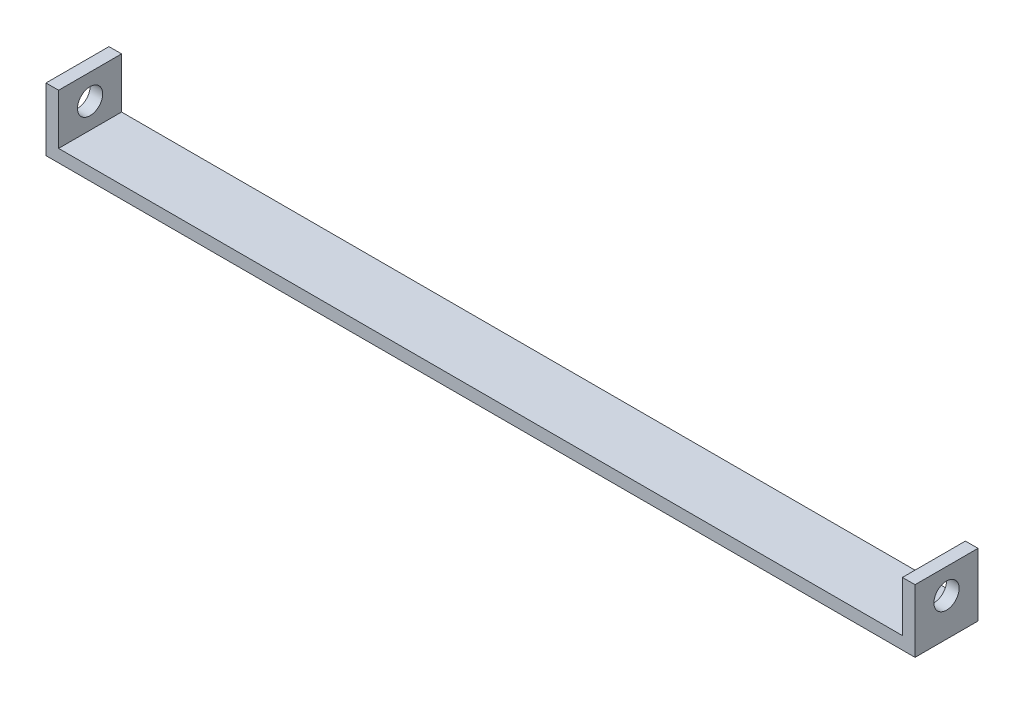
ISO-10303-21;
HEADER;
FILE_DESCRIPTION(('STEP AP214'),'2;1');
FILE_NAME('part.step','',(''),(''),'','','');
FILE_SCHEMA(('AUTOMOTIVE_DESIGN { 1 0 10303 214 1 1 1 1 }'));
ENDSEC;
DATA;
#1=APPLICATION_CONTEXT('core data for automotive mechanical design processes');
#2=APPLICATION_PROTOCOL_DEFINITION('international standard','automotive_design',2000,#1);
#3=PRODUCT_CONTEXT('',#1,'mechanical');
#4=PRODUCT('Part','Part','',(#3));
#5=PRODUCT_RELATED_PRODUCT_CATEGORY('part','',(#4));
#6=PRODUCT_DEFINITION_FORMATION('','',#4);
#7=PRODUCT_DEFINITION_CONTEXT('part definition',#1,'design');
#8=PRODUCT_DEFINITION('design','',#6,#7);
#9=PRODUCT_DEFINITION_SHAPE('','',#8);
#10=(LENGTH_UNIT() NAMED_UNIT(*) SI_UNIT(.MILLI.,.METRE.));
#11=(NAMED_UNIT(*) PLANE_ANGLE_UNIT() SI_UNIT($,.RADIAN.));
#12=(NAMED_UNIT(*) SI_UNIT($,.STERADIAN.) SOLID_ANGLE_UNIT());
#13=UNCERTAINTY_MEASURE_WITH_UNIT(LENGTH_MEASURE(1.E-05),#10,'distance_accuracy_value','');
#14=(GEOMETRIC_REPRESENTATION_CONTEXT(3) GLOBAL_UNCERTAINTY_ASSIGNED_CONTEXT((#13)) GLOBAL_UNIT_ASSIGNED_CONTEXT((#10,
#11,#12)) REPRESENTATION_CONTEXT('',''));
#15=CARTESIAN_POINT('',(0.,0.,0.));
#16=DIRECTION('',(0.,0.,1.));
#17=DIRECTION('',(1.,0.,0.));
#18=AXIS2_PLACEMENT_3D('',#15,#16,#17);
#19=CARTESIAN_POINT('',(0.,10.,10.));
#20=DIRECTION('',(1.,0.,0.));
#21=DIRECTION('',(0.,1.,0.));
#22=AXIS2_PLACEMENT_3D('',#19,#20,#21);
#23=PLANE('',#22);
#24=CARTESIAN_POINT('',(0.,6.,5.));
#25=DIRECTION('',(-1.,0.,0.));
#26=DIRECTION('',(0.,-1.,0.));
#27=AXIS2_PLACEMENT_3D('',#24,#25,#26);
#28=CIRCLE('',#27,2.);
#29=CARTESIAN_POINT('',(0.,4.,5.));
#30=VERTEX_POINT('',#29);
#31=EDGE_CURVE('E181',#30,#30,#28,.T.);
#32=ORIENTED_EDGE('',*,*,#31,.F.);
#33=EDGE_LOOP('',(#32));
#34=FACE_BOUND('',#33,.T.);
#35=DIRECTION('',(0.,-1.,0.));
#36=VECTOR('',#35,1.);
#37=CARTESIAN_POINT('',(0.,10.,0.));
#38=LINE('',#37,#36);
#39=CARTESIAN_POINT('',(0.,10.,0.));
#40=VERTEX_POINT('',#39);
#41=CARTESIAN_POINT('',(0.,0.,0.));
#42=VERTEX_POINT('',#41);
#43=EDGE_CURVE('E131',#40,#42,#38,.T.);
#44=ORIENTED_EDGE('',*,*,#43,.T.);
#45=DIRECTION('',(0.,0.,-1.));
#46=VECTOR('',#45,1.);
#47=CARTESIAN_POINT('',(0.,0.,10.));
#48=LINE('',#47,#46);
#49=CARTESIAN_POINT('',(0.,0.,10.));
#50=VERTEX_POINT('',#49);
#51=EDGE_CURVE('E11',#50,#42,#48,.T.);
#52=ORIENTED_EDGE('',*,*,#51,.F.);
#53=DIRECTION('',(0.,-1.,0.));
#54=VECTOR('',#53,1.);
#55=CARTESIAN_POINT('',(0.,10.,10.));
#56=LINE('',#55,#54);
#57=CARTESIAN_POINT('',(0.,10.,10.));
#58=VERTEX_POINT('',#57);
#59=EDGE_CURVE('E146',#58,#50,#56,.T.);
#60=ORIENTED_EDGE('',*,*,#59,.F.);
#61=DIRECTION('',(0.,0.,-1.));
#62=VECTOR('',#61,1.);
#63=CARTESIAN_POINT('',(0.,10.,10.));
#64=LINE('',#63,#62);
#65=EDGE_CURVE('E127',#58,#40,#64,.T.);
#66=ORIENTED_EDGE('',*,*,#65,.T.);
#67=EDGE_LOOP('',(#44,#52,#60,#66));
#68=FACE_BOUND('',#67,.T.);
#69=ADVANCED_FACE('F35',(#34,#68),#23,.F.);
#70=CARTESIAN_POINT('',(0.,0.,10.));
#71=DIRECTION('',(0.,1.,0.));
#72=DIRECTION('',(0.,0.,1.));
#73=AXIS2_PLACEMENT_3D('',#70,#71,#72);
#74=PLANE('',#73);
#75=DIRECTION('',(1.,0.,0.));
#76=VECTOR('',#75,1.);
#77=CARTESIAN_POINT('',(0.,0.,0.));
#78=LINE('',#77,#76);
#79=CARTESIAN_POINT('',(138.,0.,0.));
#80=VERTEX_POINT('',#79);
#81=EDGE_CURVE('E134',#42,#80,#78,.T.);
#82=ORIENTED_EDGE('',*,*,#81,.T.);
#83=DIRECTION('',(0.,0.,-1.));
#84=VECTOR('',#83,1.);
#85=CARTESIAN_POINT('',(138.,0.,10.));
#86=LINE('',#85,#84);
#87=CARTESIAN_POINT('',(138.,0.,10.));
#88=VERTEX_POINT('',#87);
#89=EDGE_CURVE('E43',#88,#80,#86,.T.);
#90=ORIENTED_EDGE('',*,*,#89,.F.);
#91=DIRECTION('',(1.,0.,0.));
#92=VECTOR('',#91,1.);
#93=CARTESIAN_POINT('',(0.,0.,10.));
#94=LINE('',#93,#92);
#95=EDGE_CURVE('E94',#50,#88,#94,.T.);
#96=ORIENTED_EDGE('',*,*,#95,.F.);
#97=ORIENTED_EDGE('',*,*,#51,.T.);
#98=EDGE_LOOP('',(#82,#90,#96,#97));
#99=FACE_BOUND('',#98,.T.);
#100=ADVANCED_FACE('F208',(#99),#74,.F.);
#101=CARTESIAN_POINT('',(138.,0.,10.));
#102=DIRECTION('',(-1.,0.,0.));
#103=DIRECTION('',(0.,0.,1.));
#104=AXIS2_PLACEMENT_3D('',#101,#102,#103);
#105=PLANE('',#104);
#106=CARTESIAN_POINT('',(138.,6.,5.));
#107=DIRECTION('',(-1.,0.,0.));
#108=DIRECTION('',(0.,-1.,0.));
#109=AXIS2_PLACEMENT_3D('',#106,#107,#108);
#110=CIRCLE('',#109,2.);
#111=CARTESIAN_POINT('',(138.,4.,5.));
#112=VERTEX_POINT('',#111);
#113=EDGE_CURVE('E187',#112,#112,#110,.T.);
#114=ORIENTED_EDGE('',*,*,#113,.T.);
#115=EDGE_LOOP('',(#114));
#116=FACE_BOUND('',#115,.T.);
#117=DIRECTION('',(0.,1.,0.));
#118=VECTOR('',#117,1.);
#119=CARTESIAN_POINT('',(138.,0.,0.));
#120=LINE('',#119,#118);
#121=CARTESIAN_POINT('',(138.,10.,0.));
#122=VERTEX_POINT('',#121);
#123=EDGE_CURVE('E137',#80,#122,#120,.T.);
#124=ORIENTED_EDGE('',*,*,#123,.T.);
#125=DIRECTION('',(0.,0.,-1.));
#126=VECTOR('',#125,1.);
#127=CARTESIAN_POINT('',(138.,10.,10.));
#128=LINE('',#127,#126);
#129=CARTESIAN_POINT('',(138.,10.,10.));
#130=VERTEX_POINT('',#129);
#131=EDGE_CURVE('E153',#130,#122,#128,.T.);
#132=ORIENTED_EDGE('',*,*,#131,.F.);
#133=DIRECTION('',(0.,1.,0.));
#134=VECTOR('',#133,1.);
#135=CARTESIAN_POINT('',(138.,0.,10.));
#136=LINE('',#135,#134);
#137=EDGE_CURVE('E161',#88,#130,#136,.T.);
#138=ORIENTED_EDGE('',*,*,#137,.F.);
#139=ORIENTED_EDGE('',*,*,#89,.T.);
#140=EDGE_LOOP('',(#124,#132,#138,#139));
#141=FACE_BOUND('',#140,.T.);
#142=ADVANCED_FACE('F159',(#116,#141),#105,.F.);
#143=CARTESIAN_POINT('',(138.,10.,10.));
#144=DIRECTION('',(0.,-1.,0.));
#145=DIRECTION('',(0.,0.,-1.));
#146=AXIS2_PLACEMENT_3D('',#143,#144,#145);
#147=PLANE('',#146);
#148=DIRECTION('',(-1.,0.,0.));
#149=VECTOR('',#148,1.);
#150=CARTESIAN_POINT('',(138.,10.,0.));
#151=LINE('',#150,#149);
#152=CARTESIAN_POINT('',(136.,10.,0.));
#153=VERTEX_POINT('',#152);
#154=EDGE_CURVE('E139',#122,#153,#151,.T.);
#155=ORIENTED_EDGE('',*,*,#154,.T.);
#156=DIRECTION('',(0.,0.,-1.));
#157=VECTOR('',#156,1.);
#158=CARTESIAN_POINT('',(136.,10.,10.));
#159=LINE('',#158,#157);
#160=CARTESIAN_POINT('',(136.,10.,10.));
#161=VERTEX_POINT('',#160);
#162=EDGE_CURVE('E150',#161,#153,#159,.T.);
#163=ORIENTED_EDGE('',*,*,#162,.F.);
#164=DIRECTION('',(-1.,0.,0.));
#165=VECTOR('',#164,1.);
#166=CARTESIAN_POINT('',(138.,10.,10.));
#167=LINE('',#166,#165);
#168=EDGE_CURVE('E173',#130,#161,#167,.T.);
#169=ORIENTED_EDGE('',*,*,#168,.F.);
#170=ORIENTED_EDGE('',*,*,#131,.T.);
#171=EDGE_LOOP('',(#155,#163,#169,#170));
#172=FACE_BOUND('',#171,.T.);
#173=ADVANCED_FACE('F169',(#172),#147,.F.);
#174=CARTESIAN_POINT('',(136.,10.,10.));
#175=DIRECTION('',(1.,0.,0.));
#176=DIRECTION('',(0.,0.,-1.));
#177=AXIS2_PLACEMENT_3D('',#174,#175,#176);
#178=PLANE('',#177);
#179=CARTESIAN_POINT('',(136.,6.,5.));
#180=DIRECTION('',(1.,0.,0.));
#181=DIRECTION('',(0.,0.,-1.));
#182=AXIS2_PLACEMENT_3D('',#179,#180,#181);
#183=CIRCLE('',#182,2.);
#184=CARTESIAN_POINT('',(136.,6.,3.));
#185=VERTEX_POINT('',#184);
#186=EDGE_CURVE('E184',#185,#185,#183,.F.);
#187=ORIENTED_EDGE('',*,*,#186,.F.);
#188=EDGE_LOOP('',(#187));
#189=FACE_BOUND('',#188,.T.);
#190=DIRECTION('',(0.,-1.,0.));
#191=VECTOR('',#190,1.);
#192=CARTESIAN_POINT('',(136.,10.,0.));
#193=LINE('',#192,#191);
#194=CARTESIAN_POINT('',(136.,2.,0.));
#195=VERTEX_POINT('',#194);
#196=EDGE_CURVE('E141',#153,#195,#193,.T.);
#197=ORIENTED_EDGE('',*,*,#196,.T.);
#198=DIRECTION('',(0.,0.,-1.));
#199=VECTOR('',#198,1.);
#200=CARTESIAN_POINT('',(136.,2.,10.));
#201=LINE('',#200,#199);
#202=CARTESIAN_POINT('',(136.,2.,10.));
#203=VERTEX_POINT('',#202);
#204=EDGE_CURVE('E122',#203,#195,#201,.T.);
#205=ORIENTED_EDGE('',*,*,#204,.F.);
#206=DIRECTION('',(0.,-1.,0.));
#207=VECTOR('',#206,1.);
#208=CARTESIAN_POINT('',(136.,10.,10.));
#209=LINE('',#208,#207);
#210=EDGE_CURVE('E113',#161,#203,#209,.T.);
#211=ORIENTED_EDGE('',*,*,#210,.F.);
#212=ORIENTED_EDGE('',*,*,#162,.T.);
#213=EDGE_LOOP('',(#197,#205,#211,#212));
#214=FACE_BOUND('',#213,.T.);
#215=ADVANCED_FACE('F172',(#189,#214),#178,.F.);
#216=CARTESIAN_POINT('',(136.,2.,10.));
#217=DIRECTION('',(0.,-1.,0.));
#218=DIRECTION('',(1.,0.,0.));
#219=AXIS2_PLACEMENT_3D('',#216,#217,#218);
#220=PLANE('',#219);
#221=DIRECTION('',(-1.,0.,0.));
#222=VECTOR('',#221,1.);
#223=CARTESIAN_POINT('',(136.,2.,0.));
#224=LINE('',#223,#222);
#225=CARTESIAN_POINT('',(2.,1.99999999999999,0.));
#226=VERTEX_POINT('',#225);
#227=EDGE_CURVE('E121',#195,#226,#224,.T.);
#228=ORIENTED_EDGE('',*,*,#227,.T.);
#229=DIRECTION('',(0.,0.,-1.));
#230=VECTOR('',#229,1.);
#231=CARTESIAN_POINT('',(2.,1.99999999999999,10.));
#232=LINE('',#231,#230);
#233=CARTESIAN_POINT('',(2.,1.99999999999999,10.));
#234=VERTEX_POINT('',#233);
#235=EDGE_CURVE('E118',#234,#226,#232,.T.);
#236=ORIENTED_EDGE('',*,*,#235,.F.);
#237=DIRECTION('',(-1.,0.,0.));
#238=VECTOR('',#237,1.);
#239=CARTESIAN_POINT('',(136.,2.,10.));
#240=LINE('',#239,#238);
#241=EDGE_CURVE('E107',#203,#234,#240,.T.);
#242=ORIENTED_EDGE('',*,*,#241,.F.);
#243=ORIENTED_EDGE('',*,*,#204,.T.);
#244=EDGE_LOOP('',(#228,#236,#242,#243));
#245=FACE_BOUND('',#244,.T.);
#246=ADVANCED_FACE('F119',(#245),#220,.F.);
#247=CARTESIAN_POINT('',(2.,1.99999999999999,10.));
#248=DIRECTION('',(-1.,0.,0.));
#249=DIRECTION('',(0.,-1.,0.));
#250=AXIS2_PLACEMENT_3D('',#247,#248,#249);
#251=PLANE('',#250);
#252=CARTESIAN_POINT('',(2.,6.,5.));
#253=DIRECTION('',(-1.,0.,0.));
#254=DIRECTION('',(0.,-1.,0.));
#255=AXIS2_PLACEMENT_3D('',#252,#253,#254);
#256=CIRCLE('',#255,2.);
#257=CARTESIAN_POINT('',(2.,4.,5.));
#258=VERTEX_POINT('',#257);
#259=EDGE_CURVE('E135',#258,#258,#256,.F.);
#260=ORIENTED_EDGE('',*,*,#259,.F.);
#261=EDGE_LOOP('',(#260));
#262=FACE_BOUND('',#261,.T.);
#263=DIRECTION('',(0.,1.,0.));
#264=VECTOR('',#263,1.);
#265=CARTESIAN_POINT('',(2.,1.99999999999999,0.));
#266=LINE('',#265,#264);
#267=CARTESIAN_POINT('',(2.,10.,0.));
#268=VERTEX_POINT('',#267);
#269=EDGE_CURVE('E80',#226,#268,#266,.T.);
#270=ORIENTED_EDGE('',*,*,#269,.T.);
#271=DIRECTION('',(0.,0.,-1.));
#272=VECTOR('',#271,1.);
#273=CARTESIAN_POINT('',(2.,10.,10.));
#274=LINE('',#273,#272);
#275=CARTESIAN_POINT('',(2.,10.,10.));
#276=VERTEX_POINT('',#275);
#277=EDGE_CURVE('E123',#276,#268,#274,.T.);
#278=ORIENTED_EDGE('',*,*,#277,.F.);
#279=DIRECTION('',(0.,1.,0.));
#280=VECTOR('',#279,1.);
#281=CARTESIAN_POINT('',(2.,1.99999999999999,10.));
#282=LINE('',#281,#280);
#283=EDGE_CURVE('E111',#234,#276,#282,.T.);
#284=ORIENTED_EDGE('',*,*,#283,.F.);
#285=ORIENTED_EDGE('',*,*,#235,.T.);
#286=EDGE_LOOP('',(#270,#278,#284,#285));
#287=FACE_BOUND('',#286,.T.);
#288=ADVANCED_FACE('F125',(#262,#287),#251,.F.);
#289=CARTESIAN_POINT('',(2.,10.,10.));
#290=DIRECTION('',(0.,-1.,0.));
#291=DIRECTION('',(0.,0.,-1.));
#292=AXIS2_PLACEMENT_3D('',#289,#290,#291);
#293=PLANE('',#292);
#294=DIRECTION('',(-1.,0.,0.));
#295=VECTOR('',#294,1.);
#296=CARTESIAN_POINT('',(2.,10.,0.));
#297=LINE('',#296,#295);
#298=EDGE_CURVE('E86',#268,#40,#297,.T.);
#299=ORIENTED_EDGE('',*,*,#298,.T.);
#300=ORIENTED_EDGE('',*,*,#65,.F.);
#301=DIRECTION('',(-1.,0.,0.));
#302=VECTOR('',#301,1.);
#303=CARTESIAN_POINT('',(2.,10.,10.));
#304=LINE('',#303,#302);
#305=EDGE_CURVE('E51',#276,#58,#304,.T.);
#306=ORIENTED_EDGE('',*,*,#305,.F.);
#307=ORIENTED_EDGE('',*,*,#277,.T.);
#308=EDGE_LOOP('',(#299,#300,#306,#307));
#309=FACE_BOUND('',#308,.T.);
#310=ADVANCED_FACE('F217',(#309),#293,.F.);
#311=CARTESIAN_POINT('',(0.,0.,10.));
#312=DIRECTION('',(0.,0.,1.));
#313=DIRECTION('',(1.,0.,0.));
#314=AXIS2_PLACEMENT_3D('',#311,#312,#313);
#315=PLANE('',#314);
#316=ORIENTED_EDGE('',*,*,#59,.T.);
#317=ORIENTED_EDGE('',*,*,#95,.T.);
#318=ORIENTED_EDGE('',*,*,#137,.T.);
#319=ORIENTED_EDGE('',*,*,#168,.T.);
#320=ORIENTED_EDGE('',*,*,#210,.T.);
#321=ORIENTED_EDGE('',*,*,#241,.T.);
#322=ORIENTED_EDGE('',*,*,#283,.T.);
#323=ORIENTED_EDGE('',*,*,#305,.T.);
#324=EDGE_LOOP('',(#316,#317,#318,#319,#320,#321,#322,#323));
#325=FACE_BOUND('',#324,.T.);
#326=ADVANCED_FACE('F109',(#325),#315,.T.);
#327=CARTESIAN_POINT('',(0.,0.,0.));
#328=DIRECTION('',(0.,0.,1.));
#329=DIRECTION('',(1.,0.,0.));
#330=AXIS2_PLACEMENT_3D('',#327,#328,#329);
#331=PLANE('',#330);
#332=ORIENTED_EDGE('',*,*,#43,.F.);
#333=ORIENTED_EDGE('',*,*,#298,.F.);
#334=ORIENTED_EDGE('',*,*,#269,.F.);
#335=ORIENTED_EDGE('',*,*,#227,.F.);
#336=ORIENTED_EDGE('',*,*,#196,.F.);
#337=ORIENTED_EDGE('',*,*,#154,.F.);
#338=ORIENTED_EDGE('',*,*,#123,.F.);
#339=ORIENTED_EDGE('',*,*,#81,.F.);
#340=EDGE_LOOP('',(#332,#333,#334,#335,#336,#337,#338,#339));
#341=FACE_BOUND('',#340,.T.);
#342=ADVANCED_FACE('F165',(#341),#331,.F.);
#343=CARTESIAN_POINT('',(7.65685424949238,6.,5.));
#344=DIRECTION('',(-1.,0.,0.));
#345=DIRECTION('',(0.,-1.,0.));
#346=AXIS2_PLACEMENT_3D('',#343,#344,#345);
#347=CYLINDRICAL_SURFACE('',#346,2.);
#348=CARTESIAN_POINT('',(2.,4.,5.));
#349=CARTESIAN_POINT('',(1.97916666666667,4.,5.));
#350=CARTESIAN_POINT('',(1.95833333333333,4.,5.));
#351=CARTESIAN_POINT('',(1.91666666666667,4.,5.));
#352=CARTESIAN_POINT('',(1.89583333333333,4.,5.));
#353=CARTESIAN_POINT('',(1.85416666666667,4.,5.));
#354=CARTESIAN_POINT('',(1.83333333333333,4.,5.));
#355=CARTESIAN_POINT('',(1.79166666666667,4.,5.));
#356=CARTESIAN_POINT('',(1.77083333333333,4.,5.));
#357=CARTESIAN_POINT('',(1.72916666666667,4.,5.));
#358=CARTESIAN_POINT('',(1.70833333333333,4.,5.));
#359=CARTESIAN_POINT('',(1.66666666666667,4.,5.));
#360=CARTESIAN_POINT('',(1.64583333333333,4.,5.));
#361=CARTESIAN_POINT('',(1.60416666666667,4.,5.));
#362=CARTESIAN_POINT('',(1.58333333333333,4.,5.));
#363=CARTESIAN_POINT('',(1.54166666666667,4.,5.));
#364=CARTESIAN_POINT('',(1.52083333333333,4.,5.));
#365=CARTESIAN_POINT('',(1.47916666666667,4.,5.));
#366=CARTESIAN_POINT('',(1.45833333333333,4.,5.));
#367=CARTESIAN_POINT('',(1.41666666666667,4.,5.));
#368=CARTESIAN_POINT('',(1.39583333333333,4.,5.));
#369=CARTESIAN_POINT('',(1.35416666666667,4.,5.));
#370=CARTESIAN_POINT('',(1.33333333333333,4.,5.));
#371=CARTESIAN_POINT('',(1.29166666666667,4.,5.));
#372=CARTESIAN_POINT('',(1.27083333333333,4.,5.));
#373=CARTESIAN_POINT('',(1.22916666666667,4.,5.));
#374=CARTESIAN_POINT('',(1.20833333333333,4.,5.));
#375=CARTESIAN_POINT('',(1.16666666666667,4.,5.));
#376=CARTESIAN_POINT('',(1.14583333333333,4.,5.));
#377=CARTESIAN_POINT('',(1.10416666666667,4.,5.));
#378=CARTESIAN_POINT('',(1.08333333333333,4.,5.));
#379=CARTESIAN_POINT('',(1.04166666666667,4.,5.));
#380=CARTESIAN_POINT('',(1.02083333333333,4.,5.));
#381=CARTESIAN_POINT('',(0.979166666666667,4.,5.));
#382=CARTESIAN_POINT('',(0.958333333333333,4.,5.));
#383=CARTESIAN_POINT('',(0.916666666666667,4.,5.));
#384=CARTESIAN_POINT('',(0.895833333333333,4.,5.));
#385=CARTESIAN_POINT('',(0.854166666666667,4.,5.));
#386=CARTESIAN_POINT('',(0.833333333333333,4.,5.));
#387=CARTESIAN_POINT('',(0.791666666666667,4.,5.));
#388=CARTESIAN_POINT('',(0.770833333333333,4.,5.));
#389=CARTESIAN_POINT('',(0.729166666666667,4.,5.));
#390=CARTESIAN_POINT('',(0.708333333333333,4.,5.));
#391=CARTESIAN_POINT('',(0.666666666666666,4.,5.));
#392=CARTESIAN_POINT('',(0.645833333333333,4.,5.));
#393=CARTESIAN_POINT('',(0.604166666666666,4.,5.));
#394=CARTESIAN_POINT('',(0.583333333333333,4.,5.));
#395=CARTESIAN_POINT('',(0.541666666666666,4.,5.));
#396=CARTESIAN_POINT('',(0.520833333333333,4.,5.));
#397=CARTESIAN_POINT('',(0.479166666666666,4.,5.));
#398=CARTESIAN_POINT('',(0.458333333333333,4.,5.));
#399=CARTESIAN_POINT('',(0.416666666666666,4.,5.));
#400=CARTESIAN_POINT('',(0.395833333333333,4.,5.));
#401=CARTESIAN_POINT('',(0.354166666666666,4.,5.));
#402=CARTESIAN_POINT('',(0.333333333333333,4.,5.));
#403=CARTESIAN_POINT('',(0.291666666666666,4.,5.));
#404=CARTESIAN_POINT('',(0.270833333333333,4.,5.));
#405=CARTESIAN_POINT('',(0.229166666666666,4.,5.));
#406=CARTESIAN_POINT('',(0.208333333333333,4.,5.));
#407=CARTESIAN_POINT('',(0.166666666666666,4.,5.));
#408=CARTESIAN_POINT('',(0.145833333333333,4.,5.));
#409=CARTESIAN_POINT('',(0.104166666666666,4.,5.));
#410=CARTESIAN_POINT('',(0.0833333333333325,4.,5.));
#411=CARTESIAN_POINT('',(0.0416666666666658,4.,5.));
#412=CARTESIAN_POINT('',(0.0208333333333325,4.,5.));
#413=CARTESIAN_POINT('',(0.,4.,5.));
#414=B_SPLINE_CURVE_WITH_KNOTS('',3,(#348,#349,#350,#351,#352,#353,#354,#355,#356,#357,#358,
#359,#360,#361,#362,#363,#364,#365,#366,#367,#368,#369,#370,#371,#372,#373,#374,#375,#376,#377,
#378,#379,#380,#381,#382,#383,#384,#385,#386,#387,#388,#389,#390,#391,#392,#393,#394,#395,#396,
#397,#398,#399,#400,#401,#402,#403,#404,#405,#406,#407,#408,#409,#410,#411,#412,#413),
.UNSPECIFIED.,.F.,.F.,(4,2,2,2,2,2,2,2,2,2,2,2,2,2,2,2,2,2,2,2,2,2,2,2,2,2,2,2,2,2,2,2,4),(0.,
0.0625000000000001,0.125,0.1875,0.25,0.3125,0.375,0.4375,0.5,0.5625,0.625000000000001,
0.687500000000001,0.750000000000001,0.812500000000001,0.875000000000001,0.937500000000001,1.,
1.0625,1.125,1.1875,1.25,1.3125,1.375,1.4375,1.5,1.5625,1.625,1.6875,1.75,1.8125,1.875,1.9375,
2.),.UNSPECIFIED.);
#415=EDGE_CURVE('BSEAM195',#258,#30,#414,.T.);
#416=ORIENTED_EDGE('',*,*,#259,.T.);
#417=ORIENTED_EDGE('',*,*,#31,.T.);
#418=ORIENTED_EDGE('',*,*,#415,.T.);
#419=ORIENTED_EDGE('',*,*,#415,.F.);
#420=EDGE_LOOP('',(#416,#418,#417,#419));
#421=FACE_BOUND('',#420,.T.);
#422=ADVANCED_FACE('F195',(#421),#347,.F.);
#423=CARTESIAN_POINT('',(-3.65685424949236,6.,5.));
#424=DIRECTION('',(1.,0.,0.));
#425=DIRECTION('',(0.,0.,-1.));
#426=AXIS2_PLACEMENT_3D('',#423,#424,#425);
#427=CYLINDRICAL_SURFACE('',#426,2.);
#428=ORIENTED_EDGE('',*,*,#113,.F.);
#429=EDGE_LOOP('',(#428));
#430=FACE_BOUND('',#429,.T.);
#431=ORIENTED_EDGE('',*,*,#186,.T.);
#432=EDGE_LOOP('',(#431));
#433=FACE_BOUND('',#432,.T.);
#434=ADVANCED_FACE('F192',(#430,#433),#427,.F.);
#435=CLOSED_SHELL('',(#69,#100,#142,#173,#215,#246,#288,#310,#326,#342,#422,#434));
#436=MANIFOLD_SOLID_BREP('B2',#435);
#437=ADVANCED_BREP_SHAPE_REPRESENTATION('',(#18,#436),#14);
#438=SHAPE_DEFINITION_REPRESENTATION(#9,#437);
ENDSEC;
END-ISO-10303-21;
